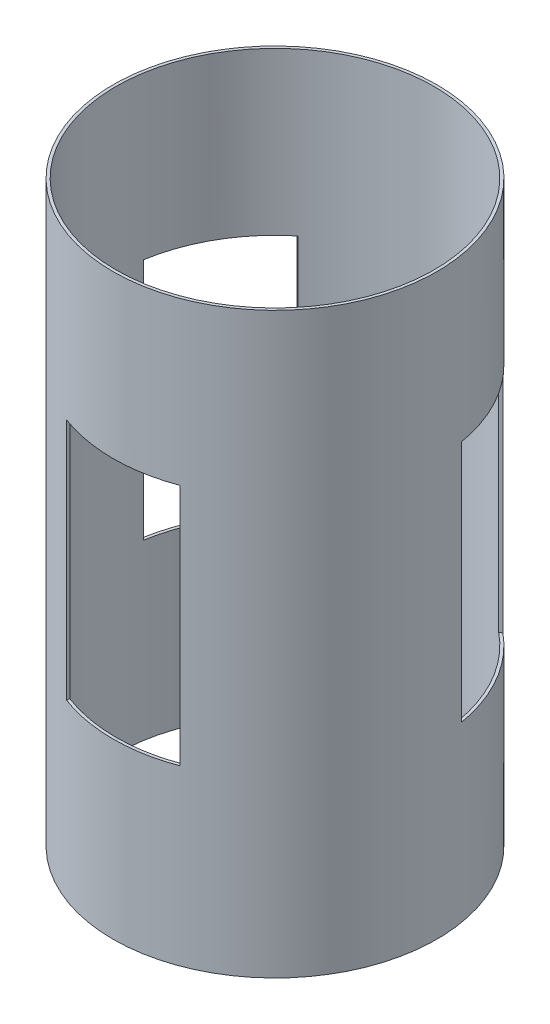
ISO-10303-21;
HEADER;
FILE_DESCRIPTION(('STEP AP214'),'2;1');
FILE_NAME('part.step','',(''),(''),'','','');
FILE_SCHEMA(('AUTOMOTIVE_DESIGN { 1 0 10303 214 1 1 1 1 }'));
ENDSEC;
DATA;
#1=APPLICATION_CONTEXT('core data for automotive mechanical design processes');
#2=APPLICATION_PROTOCOL_DEFINITION('international standard','automotive_design',2000,#1);
#3=PRODUCT_CONTEXT('',#1,'mechanical');
#4=PRODUCT('Part','Part','',(#3));
#5=PRODUCT_RELATED_PRODUCT_CATEGORY('part','',(#4));
#6=PRODUCT_DEFINITION_FORMATION('','',#4);
#7=PRODUCT_DEFINITION_CONTEXT('part definition',#1,'design');
#8=PRODUCT_DEFINITION('design','',#6,#7);
#9=PRODUCT_DEFINITION_SHAPE('','',#8);
#10=(LENGTH_UNIT() NAMED_UNIT(*) SI_UNIT(.MILLI.,.METRE.));
#11=(NAMED_UNIT(*) PLANE_ANGLE_UNIT() SI_UNIT($,.RADIAN.));
#12=(NAMED_UNIT(*) SI_UNIT($,.STERADIAN.) SOLID_ANGLE_UNIT());
#13=UNCERTAINTY_MEASURE_WITH_UNIT(LENGTH_MEASURE(1.E-05),#10,'distance_accuracy_value','');
#14=(GEOMETRIC_REPRESENTATION_CONTEXT(3) GLOBAL_UNCERTAINTY_ASSIGNED_CONTEXT((#13)) GLOBAL_UNIT_ASSIGNED_CONTEXT((#10,
#11,#12)) REPRESENTATION_CONTEXT('',''));
#15=CARTESIAN_POINT('',(0.,0.,0.));
#16=DIRECTION('',(0.,0.,1.));
#17=DIRECTION('',(1.,0.,0.));
#18=AXIS2_PLACEMENT_3D('',#15,#16,#17);
#19=CARTESIAN_POINT('',(0.,105.,0.));
#20=DIRECTION('',(0.,1.,0.));
#21=DIRECTION('',(0.,0.,1.));
#22=AXIS2_PLACEMENT_3D('',#19,#20,#21);
#23=PLANE('',#22);
#24=DIRECTION('',(0.866025403784442,0.,0.499999999999995));
#25=VECTOR('',#24,1.);
#26=CARTESIAN_POINT('',(12.2359582847371,105.,-21.1933014284583));
#27=LINE('',#26,#25);
#28=CARTESIAN_POINT('',(-44.56055546886,105.,-53.9847839331293));
#29=VERTEX_POINT('',#28);
#30=CARTESIAN_POINT('',(-43.4036485575343,105.,-53.3168434164482));
#31=VERTEX_POINT('',#30);
#32=EDGE_CURVE('E254',#29,#31,#27,.T.);
#33=ORIENTED_EDGE('',*,*,#32,.T.);
#34=CARTESIAN_POINT('',(0.,105.,0.));
#35=DIRECTION('',(0.,1.,0.));
#36=DIRECTION('',(0.,0.,1.));
#37=AXIS2_PLACEMENT_3D('',#34,#35,#36);
#38=CIRCLE('',#37,68.75);
#39=CARTESIAN_POINT('',(-67.8755651270083,105.,-10.9302405595327));
#40=VERTEX_POINT('',#39);
#41=EDGE_CURVE('E165',#31,#40,#38,.T.);
#42=ORIENTED_EDGE('',*,*,#41,.T.);
#43=DIRECTION('',(0.86602540378444,0.,0.499999999999999));
#44=VECTOR('',#43,1.);
#45=CARTESIAN_POINT('',(-12.2359582847368,105.,21.1933014284576));
#46=LINE('',#45,#44);
#47=CARTESIAN_POINT('',(-69.0324720383339,105.,-11.5981810762138));
#48=VERTEX_POINT('',#47);
#49=EDGE_CURVE('E213',#48,#40,#46,.T.);
#50=ORIENTED_EDGE('',*,*,#49,.F.);
#51=CARTESIAN_POINT('',(0.,105.,0.));
#52=DIRECTION('',(0.,1.,0.));
#53=DIRECTION('',(0.,0.,1.));
#54=AXIS2_PLACEMENT_3D('',#51,#52,#53);
#55=CIRCLE('',#54,70.);
#56=EDGE_CURVE('E66',#29,#48,#55,.T.);
#57=ORIENTED_EDGE('',*,*,#56,.F.);
#58=EDGE_LOOP('',(#33,#42,#50,#57));
#59=FACE_BOUND('',#58,.T.);
#60=ADVANCED_FACE('F50',(#59),#23,.F.);
#61=CARTESIAN_POINT('',(67.8755651270083,105.,-10.9302405595325));
#62=VERTEX_POINT('',#61);
#63=CARTESIAN_POINT('',(43.4036485575344,105.,-53.3168434164481));
#64=VERTEX_POINT('',#63);
#65=EDGE_CURVE('E204',#62,#64,#38,.T.);
#66=ORIENTED_EDGE('',*,*,#65,.T.);
#67=DIRECTION('',(-0.866025403784438,0.,0.500000000000001));
#68=VECTOR('',#67,1.);
#69=CARTESIAN_POINT('',(-12.235958284737,105.,-21.1933014284577));
#70=LINE('',#69,#68);
#71=CARTESIAN_POINT('',(44.56055546886,105.,-53.9847839331293));
#72=VERTEX_POINT('',#71);
#73=EDGE_CURVE('E74',#72,#64,#70,.T.);
#74=ORIENTED_EDGE('',*,*,#73,.F.);
#75=CARTESIAN_POINT('',(69.032472038334,105.,-11.5981810762138));
#76=VERTEX_POINT('',#75);
#77=EDGE_CURVE('E212',#76,#72,#55,.T.);
#78=ORIENTED_EDGE('',*,*,#77,.F.);
#79=DIRECTION('',(-0.866025403784427,0.,0.500000000000021));
#80=VECTOR('',#79,1.);
#81=CARTESIAN_POINT('',(12.2359582847382,105.,21.1933014284588));
#82=LINE('',#81,#80);
#83=EDGE_CURVE('E185',#76,#62,#82,.T.);
#84=ORIENTED_EDGE('',*,*,#83,.T.);
#85=EDGE_LOOP('',(#66,#74,#78,#84));
#86=FACE_BOUND('',#85,.T.);
#87=ADVANCED_FACE('F327',(#86),#23,.F.);
#88=CARTESIAN_POINT('',(-12.2359582847368,105.,21.1933014284576));
#89=DIRECTION('',(0.499999999999999,0.,-0.866025403784439));
#90=DIRECTION('',(-0.866025403784439,0.,-0.499999999999999));
#91=AXIS2_PLACEMENT_3D('',#88,#89,#90);
#92=PLANE('',#91);
#93=DIRECTION('',(0.86602540378444,0.,0.499999999999999));
#94=VECTOR('',#93,1.);
#95=CARTESIAN_POINT('',(-12.2359582847368,0.,21.1933014284576));
#96=LINE('',#95,#94);
#97=CARTESIAN_POINT('',(-69.0324720383339,0.,-11.5981810762139));
#98=VERTEX_POINT('',#97);
#99=CARTESIAN_POINT('',(-67.8755651270083,0.,-10.9302405595327));
#100=VERTEX_POINT('',#99);
#101=EDGE_CURVE('E209',#98,#100,#96,.T.);
#102=ORIENTED_EDGE('',*,*,#101,.F.);
#103=DIRECTION('',(0.,-1.,0.));
#104=VECTOR('',#103,1.);
#105=CARTESIAN_POINT('',(-69.0324720383339,105.,-11.5981810762138));
#106=LINE('',#105,#104);
#107=EDGE_CURVE('E12',#48,#98,#106,.T.);
#108=ORIENTED_EDGE('',*,*,#107,.F.);
#109=ORIENTED_EDGE('',*,*,#49,.T.);
#110=DIRECTION('',(0.,-1.,0.));
#111=VECTOR('',#110,1.);
#112=CARTESIAN_POINT('',(-67.8755651270083,105.,-10.9302405595327));
#113=LINE('',#112,#111);
#114=EDGE_CURVE('E221',#40,#100,#113,.T.);
#115=ORIENTED_EDGE('',*,*,#114,.T.);
#116=EDGE_LOOP('',(#102,#108,#109,#115));
#117=FACE_BOUND('',#116,.T.);
#118=ADVANCED_FACE('F52',(#117),#92,.T.);
#119=CARTESIAN_POINT('',(0.,105.,0.));
#120=DIRECTION('',(0.,-1.,0.));
#121=DIRECTION('',(0.,0.,-1.));
#122=AXIS2_PLACEMENT_3D('',#119,#120,#121);
#123=CYLINDRICAL_SURFACE('',#122,70.);
#124=CARTESIAN_POINT('',(0.,0.,0.));
#125=DIRECTION('',(0.,1.,0.));
#126=DIRECTION('',(0.,0.,1.));
#127=AXIS2_PLACEMENT_3D('',#124,#125,#126);
#128=CIRCLE('',#127,70.);
#129=CARTESIAN_POINT('',(-24.4719165694739,0.,65.582965009343));
#130=VERTEX_POINT('',#129);
#131=CARTESIAN_POINT('',(24.4719165694739,0.,65.582965009343));
#132=VERTEX_POINT('',#131);
#133=EDGE_CURVE('E140',#130,#132,#128,.T.);
#134=ORIENTED_EDGE('',*,*,#133,.F.);
#135=DIRECTION('',(0.,-1.,0.));
#136=VECTOR('',#135,1.);
#137=CARTESIAN_POINT('',(-24.4719165694739,105.,65.582965009343));
#138=LINE('',#137,#136);
#139=CARTESIAN_POINT('',(-24.4719165694739,105.,65.582965009343));
#140=VERTEX_POINT('',#139);
#141=EDGE_CURVE('E59',#140,#130,#138,.T.);
#142=ORIENTED_EDGE('',*,*,#141,.F.);
#143=CARTESIAN_POINT('',(24.4719165694739,105.,65.582965009343));
#144=VERTEX_POINT('',#143);
#145=EDGE_CURVE('E161',#140,#144,#55,.T.);
#146=ORIENTED_EDGE('',*,*,#145,.T.);
#147=DIRECTION('',(0.,-1.,0.));
#148=VECTOR('',#147,1.);
#149=CARTESIAN_POINT('',(24.4719165694739,105.,65.582965009343));
#150=LINE('',#149,#148);
#151=EDGE_CURVE('E157',#144,#132,#150,.T.);
#152=ORIENTED_EDGE('',*,*,#151,.T.);
#153=EDGE_LOOP('',(#134,#142,#146,#152));
#154=FACE_BOUND('',#153,.T.);
#155=CARTESIAN_POINT('',(69.032472038334,0.,-11.5981810762138));
#156=VERTEX_POINT('',#155);
#157=CARTESIAN_POINT('',(44.56055546886,0.,-53.9847839331293));
#158=VERTEX_POINT('',#157);
#159=EDGE_CURVE('E154',#156,#158,#128,.T.);
#160=ORIENTED_EDGE('',*,*,#159,.F.);
#161=DIRECTION('',(0.,-1.,0.));
#162=VECTOR('',#161,1.);
#163=CARTESIAN_POINT('',(69.032472038334,105.,-11.5981810762138));
#164=LINE('',#163,#162);
#165=EDGE_CURVE('E166',#76,#156,#164,.T.);
#166=ORIENTED_EDGE('',*,*,#165,.F.);
#167=ORIENTED_EDGE('',*,*,#77,.T.);
#168=DIRECTION('',(0.,-1.,0.));
#169=VECTOR('',#168,1.);
#170=CARTESIAN_POINT('',(44.5605554688601,105.,-53.9847839331293));
#171=LINE('',#170,#169);
#172=EDGE_CURVE('E174',#72,#158,#171,.T.);
#173=ORIENTED_EDGE('',*,*,#172,.T.);
#174=EDGE_LOOP('',(#160,#166,#167,#173));
#175=FACE_BOUND('',#174,.T.);
#176=ORIENTED_EDGE('',*,*,#107,.T.);
#177=CARTESIAN_POINT('',(-44.56055546886,0.,-53.9847839331294));
#178=VERTEX_POINT('',#177);
#179=EDGE_CURVE('E151',#178,#98,#128,.T.);
#180=ORIENTED_EDGE('',*,*,#179,.F.);
#181=DIRECTION('',(0.,-1.,0.));
#182=VECTOR('',#181,1.);
#183=CARTESIAN_POINT('',(-44.56055546886,105.,-53.9847839331294));
#184=LINE('',#183,#182);
#185=EDGE_CURVE('E182',#29,#178,#184,.T.);
#186=ORIENTED_EDGE('',*,*,#185,.F.);
#187=ORIENTED_EDGE('',*,*,#56,.T.);
#188=EDGE_LOOP('',(#176,#180,#186,#187));
#189=FACE_BOUND('',#188,.T.);
#190=CARTESIAN_POINT('',(0.,175.,0.));
#191=DIRECTION('',(0.,1.,0.));
#192=DIRECTION('',(0.,0.,1.));
#193=AXIS2_PLACEMENT_3D('',#190,#191,#192);
#194=CIRCLE('',#193,70.);
#195=CARTESIAN_POINT('',(0.,175.,70.));
#196=VERTEX_POINT('',#195);
#197=EDGE_CURVE('E205',#196,#196,#194,.T.);
#198=ORIENTED_EDGE('',*,*,#197,.F.);
#199=EDGE_LOOP('',(#198));
#200=FACE_BOUND('',#199,.T.);
#201=CARTESIAN_POINT('',(0.,-75.,0.));
#202=DIRECTION('',(0.,1.,0.));
#203=DIRECTION('',(0.,0.,1.));
#204=AXIS2_PLACEMENT_3D('',#201,#202,#203);
#205=CIRCLE('',#204,70.);
#206=CARTESIAN_POINT('',(0.,-75.,70.));
#207=VERTEX_POINT('',#206);
#208=EDGE_CURVE('E262',#207,#207,#205,.T.);
#209=ORIENTED_EDGE('',*,*,#208,.T.);
#210=EDGE_LOOP('',(#209));
#211=FACE_BOUND('',#210,.T.);
#212=ADVANCED_FACE('F158',(#154,#175,#189,#200,#211),#123,.T.);
#213=CARTESIAN_POINT('',(-24.4719165694741,105.,0.));
#214=DIRECTION('',(-1.,0.,0.));
#215=DIRECTION('',(0.,0.,1.));
#216=AXIS2_PLACEMENT_3D('',#213,#214,#215);
#217=PLANE('',#216);
#218=DIRECTION('',(0.,0.,-1.));
#219=VECTOR('',#218,1.);
#220=CARTESIAN_POINT('',(-24.4719165694741,0.,0.));
#221=LINE('',#220,#219);
#222=CARTESIAN_POINT('',(-24.4719165694739,0.,64.2470839759806));
#223=VERTEX_POINT('',#222);
#224=EDGE_CURVE('E147',#130,#223,#221,.T.);
#225=ORIENTED_EDGE('',*,*,#224,.T.);
#226=DIRECTION('',(0.,-1.,0.));
#227=VECTOR('',#226,1.);
#228=CARTESIAN_POINT('',(-24.4719165694739,105.,64.2470839759806));
#229=LINE('',#228,#227);
#230=CARTESIAN_POINT('',(-24.4719165694739,105.,64.2470839759806));
#231=VERTEX_POINT('',#230);
#232=EDGE_CURVE('E229',#231,#223,#229,.T.);
#233=ORIENTED_EDGE('',*,*,#232,.F.);
#234=DIRECTION('',(0.,0.,-1.));
#235=VECTOR('',#234,1.);
#236=CARTESIAN_POINT('',(-24.4719165694741,105.,0.));
#237=LINE('',#236,#235);
#238=EDGE_CURVE('E217',#140,#231,#237,.T.);
#239=ORIENTED_EDGE('',*,*,#238,.F.);
#240=ORIENTED_EDGE('',*,*,#141,.T.);
#241=EDGE_LOOP('',(#225,#233,#239,#240));
#242=FACE_BOUND('',#241,.T.);
#243=ADVANCED_FACE('F235',(#242),#217,.F.);
#244=CARTESIAN_POINT('',(0.,105.,0.));
#245=DIRECTION('',(0.,-1.,0.));
#246=DIRECTION('',(0.,0.,-1.));
#247=AXIS2_PLACEMENT_3D('',#244,#245,#246);
#248=CYLINDRICAL_SURFACE('',#247,68.75);
#249=ORIENTED_EDGE('',*,*,#232,.T.);
#250=CARTESIAN_POINT('',(0.,0.,0.));
#251=DIRECTION('',(0.,1.,0.));
#252=DIRECTION('',(0.,0.,1.));
#253=AXIS2_PLACEMENT_3D('',#250,#251,#252);
#254=CIRCLE('',#253,68.75);
#255=CARTESIAN_POINT('',(24.4719165694739,0.,64.2470839759806));
#256=VERTEX_POINT('',#255);
#257=EDGE_CURVE('E267',#223,#256,#254,.T.);
#258=ORIENTED_EDGE('',*,*,#257,.T.);
#259=DIRECTION('',(0.,-1.,0.));
#260=VECTOR('',#259,1.);
#261=CARTESIAN_POINT('',(24.4719165694739,105.,64.2470839759806));
#262=LINE('',#261,#260);
#263=CARTESIAN_POINT('',(24.4719165694739,105.,64.2470839759806));
#264=VERTEX_POINT('',#263);
#265=EDGE_CURVE('E171',#264,#256,#262,.T.);
#266=ORIENTED_EDGE('',*,*,#265,.F.);
#267=EDGE_CURVE('E201',#231,#264,#38,.T.);
#268=ORIENTED_EDGE('',*,*,#267,.F.);
#269=EDGE_LOOP('',(#249,#258,#266,#268));
#270=FACE_BOUND('',#269,.T.);
#271=DIRECTION('',(0.,-1.,0.));
#272=VECTOR('',#271,1.);
#273=CARTESIAN_POINT('',(67.8755651270083,105.,-10.9302405595325));
#274=LINE('',#273,#272);
#275=CARTESIAN_POINT('',(67.8755651270083,0.,-10.9302405595325));
#276=VERTEX_POINT('',#275);
#277=EDGE_CURVE('E190',#62,#276,#274,.T.);
#278=ORIENTED_EDGE('',*,*,#277,.T.);
#279=CARTESIAN_POINT('',(43.4036485575344,0.,-53.3168434164481));
#280=VERTEX_POINT('',#279);
#281=EDGE_CURVE('E152',#276,#280,#254,.T.);
#282=ORIENTED_EDGE('',*,*,#281,.T.);
#283=DIRECTION('',(0.,-1.,0.));
#284=VECTOR('',#283,1.);
#285=CARTESIAN_POINT('',(43.4036485575344,105.,-53.3168434164481));
#286=LINE('',#285,#284);
#287=EDGE_CURVE('E250',#64,#280,#286,.T.);
#288=ORIENTED_EDGE('',*,*,#287,.F.);
#289=ORIENTED_EDGE('',*,*,#65,.F.);
#290=EDGE_LOOP('',(#278,#282,#288,#289));
#291=FACE_BOUND('',#290,.T.);
#292=CARTESIAN_POINT('',(-43.4036485575343,0.,-53.3168434164482));
#293=VERTEX_POINT('',#292);
#294=EDGE_CURVE('E270',#293,#100,#254,.T.);
#295=ORIENTED_EDGE('',*,*,#294,.T.);
#296=ORIENTED_EDGE('',*,*,#114,.F.);
#297=ORIENTED_EDGE('',*,*,#41,.F.);
#298=DIRECTION('',(0.,-1.,0.));
#299=VECTOR('',#298,1.);
#300=CARTESIAN_POINT('',(-43.4036485575343,105.,-53.3168434164482));
#301=LINE('',#300,#299);
#302=EDGE_CURVE('E246',#31,#293,#301,.T.);
#303=ORIENTED_EDGE('',*,*,#302,.T.);
#304=EDGE_LOOP('',(#295,#296,#297,#303));
#305=FACE_BOUND('',#304,.T.);
#306=CARTESIAN_POINT('',(0.,175.,0.));
#307=DIRECTION('',(0.,1.,0.));
#308=DIRECTION('',(0.,0.,1.));
#309=AXIS2_PLACEMENT_3D('',#306,#307,#308);
#310=CIRCLE('',#309,68.75);
#311=CARTESIAN_POINT('',(0.,175.,68.75));
#312=VERTEX_POINT('',#311);
#313=EDGE_CURVE('E197',#312,#312,#310,.T.);
#314=ORIENTED_EDGE('',*,*,#313,.T.);
#315=EDGE_LOOP('',(#314));
#316=FACE_BOUND('',#315,.T.);
#317=CARTESIAN_POINT('',(0.,-75.,0.));
#318=DIRECTION('',(0.,1.,0.));
#319=DIRECTION('',(0.,0.,1.));
#320=AXIS2_PLACEMENT_3D('',#317,#318,#319);
#321=CIRCLE('',#320,68.75);
#322=CARTESIAN_POINT('',(0.,-75.,68.75));
#323=VERTEX_POINT('',#322);
#324=EDGE_CURVE('E274',#323,#323,#321,.T.);
#325=ORIENTED_EDGE('',*,*,#324,.F.);
#326=EDGE_LOOP('',(#325));
#327=FACE_BOUND('',#326,.T.);
#328=ADVANCED_FACE('F294',(#270,#291,#305,#316,#327),#248,.F.);
#329=CARTESIAN_POINT('',(0.,175.,0.));
#330=DIRECTION('',(0.,1.,0.));
#331=DIRECTION('',(0.,0.,1.));
#332=AXIS2_PLACEMENT_3D('',#329,#330,#331);
#333=PLANE('',#332);
#334=ORIENTED_EDGE('',*,*,#197,.T.);
#335=EDGE_LOOP('',(#334));
#336=FACE_BOUND('',#335,.T.);
#337=ORIENTED_EDGE('',*,*,#313,.F.);
#338=EDGE_LOOP('',(#337));
#339=FACE_BOUND('',#338,.T.);
#340=ADVANCED_FACE('F335',(#336,#339),#333,.T.);
#341=ORIENTED_EDGE('',*,*,#267,.T.);
#342=DIRECTION('',(0.,0.,-1.));
#343=VECTOR('',#342,1.);
#344=CARTESIAN_POINT('',(24.4719165694741,105.,0.));
#345=LINE('',#344,#343);
#346=EDGE_CURVE('E179',#144,#264,#345,.T.);
#347=ORIENTED_EDGE('',*,*,#346,.F.);
#348=ORIENTED_EDGE('',*,*,#145,.F.);
#349=ORIENTED_EDGE('',*,*,#238,.T.);
#350=EDGE_LOOP('',(#341,#347,#348,#349));
#351=FACE_BOUND('',#350,.T.);
#352=ADVANCED_FACE('F238',(#351),#23,.F.);
#353=CARTESIAN_POINT('',(24.4719165694741,105.,0.));
#354=DIRECTION('',(-1.,0.,0.));
#355=DIRECTION('',(0.,0.,1.));
#356=AXIS2_PLACEMENT_3D('',#353,#354,#355);
#357=PLANE('',#356);
#358=DIRECTION('',(0.,0.,-1.));
#359=VECTOR('',#358,1.);
#360=CARTESIAN_POINT('',(24.4719165694741,0.,0.));
#361=LINE('',#360,#359);
#362=EDGE_CURVE('E144',#132,#256,#361,.T.);
#363=ORIENTED_EDGE('',*,*,#362,.F.);
#364=ORIENTED_EDGE('',*,*,#151,.F.);
#365=ORIENTED_EDGE('',*,*,#346,.T.);
#366=ORIENTED_EDGE('',*,*,#265,.T.);
#367=EDGE_LOOP('',(#363,#364,#365,#366));
#368=FACE_BOUND('',#367,.T.);
#369=ADVANCED_FACE('F169',(#368),#357,.T.);
#370=CARTESIAN_POINT('',(12.2359582847382,105.,21.1933014284588));
#371=DIRECTION('',(0.500000000000021,0.,0.866025403784427));
#372=DIRECTION('',(0.866025403784427,0.,-0.500000000000021));
#373=AXIS2_PLACEMENT_3D('',#370,#371,#372);
#374=PLANE('',#373);
#375=DIRECTION('',(-0.866025403784427,0.,0.500000000000021));
#376=VECTOR('',#375,1.);
#377=CARTESIAN_POINT('',(12.2359582847382,0.,21.1933014284588));
#378=LINE('',#377,#376);
#379=EDGE_CURVE('E173',#156,#276,#378,.T.);
#380=ORIENTED_EDGE('',*,*,#379,.T.);
#381=ORIENTED_EDGE('',*,*,#277,.F.);
#382=ORIENTED_EDGE('',*,*,#83,.F.);
#383=ORIENTED_EDGE('',*,*,#165,.T.);
#384=EDGE_LOOP('',(#380,#381,#382,#383));
#385=FACE_BOUND('',#384,.T.);
#386=ADVANCED_FACE('F324',(#385),#374,.F.);
#387=CARTESIAN_POINT('',(-12.235958284737,105.,-21.1933014284577));
#388=DIRECTION('',(0.500000000000001,0.,0.866025403784438));
#389=DIRECTION('',(0.866025403784438,0.,-0.500000000000001));
#390=AXIS2_PLACEMENT_3D('',#387,#388,#389);
#391=PLANE('',#390);
#392=DIRECTION('',(-0.866025403784438,0.,0.500000000000001));
#393=VECTOR('',#392,1.);
#394=CARTESIAN_POINT('',(-12.235958284737,0.,-21.1933014284577));
#395=LINE('',#394,#393);
#396=EDGE_CURVE('E259',#158,#280,#395,.T.);
#397=ORIENTED_EDGE('',*,*,#396,.F.);
#398=ORIENTED_EDGE('',*,*,#172,.F.);
#399=ORIENTED_EDGE('',*,*,#73,.T.);
#400=ORIENTED_EDGE('',*,*,#287,.T.);
#401=EDGE_LOOP('',(#397,#398,#399,#400));
#402=FACE_BOUND('',#401,.T.);
#403=ADVANCED_FACE('F305',(#402),#391,.T.);
#404=CARTESIAN_POINT('',(12.2359582847371,105.,-21.1933014284583));
#405=DIRECTION('',(0.499999999999995,0.,-0.866025403784442));
#406=DIRECTION('',(-0.866025403784442,0.,-0.499999999999995));
#407=AXIS2_PLACEMENT_3D('',#404,#405,#406);
#408=PLANE('',#407);
#409=DIRECTION('',(0.866025403784442,0.,0.499999999999995));
#410=VECTOR('',#409,1.);
#411=CARTESIAN_POINT('',(12.2359582847371,0.,-21.1933014284583));
#412=LINE('',#411,#410);
#413=EDGE_CURVE('E255',#178,#293,#412,.T.);
#414=ORIENTED_EDGE('',*,*,#413,.T.);
#415=ORIENTED_EDGE('',*,*,#302,.F.);
#416=ORIENTED_EDGE('',*,*,#32,.F.);
#417=ORIENTED_EDGE('',*,*,#185,.T.);
#418=EDGE_LOOP('',(#414,#415,#416,#417));
#419=FACE_BOUND('',#418,.T.);
#420=ADVANCED_FACE('F315',(#419),#408,.F.);
#421=CARTESIAN_POINT('',(0.,0.,0.));
#422=DIRECTION('',(0.,1.,0.));
#423=DIRECTION('',(0.,0.,1.));
#424=AXIS2_PLACEMENT_3D('',#421,#422,#423);
#425=PLANE('',#424);
#426=ORIENTED_EDGE('',*,*,#224,.F.);
#427=ORIENTED_EDGE('',*,*,#133,.T.);
#428=ORIENTED_EDGE('',*,*,#362,.T.);
#429=ORIENTED_EDGE('',*,*,#257,.F.);
#430=EDGE_LOOP('',(#426,#427,#428,#429));
#431=FACE_BOUND('',#430,.T.);
#432=ADVANCED_FACE('F142',(#431),#425,.T.);
#433=ORIENTED_EDGE('',*,*,#379,.F.);
#434=ORIENTED_EDGE('',*,*,#159,.T.);
#435=ORIENTED_EDGE('',*,*,#396,.T.);
#436=ORIENTED_EDGE('',*,*,#281,.F.);
#437=EDGE_LOOP('',(#433,#434,#435,#436));
#438=FACE_BOUND('',#437,.T.);
#439=ADVANCED_FACE('F322',(#438),#425,.T.);
#440=CARTESIAN_POINT('',(0.,-75.,0.));
#441=DIRECTION('',(0.,1.,0.));
#442=DIRECTION('',(0.,0.,1.));
#443=AXIS2_PLACEMENT_3D('',#440,#441,#442);
#444=PLANE('',#443);
#445=ORIENTED_EDGE('',*,*,#324,.T.);
#446=EDGE_LOOP('',(#445));
#447=FACE_BOUND('',#446,.T.);
#448=ORIENTED_EDGE('',*,*,#208,.F.);
#449=EDGE_LOOP('',(#448));
#450=FACE_BOUND('',#449,.T.);
#451=ADVANCED_FACE('F353',(#447,#450),#444,.F.);
#452=ORIENTED_EDGE('',*,*,#179,.T.);
#453=ORIENTED_EDGE('',*,*,#101,.T.);
#454=ORIENTED_EDGE('',*,*,#294,.F.);
#455=ORIENTED_EDGE('',*,*,#413,.F.);
#456=EDGE_LOOP('',(#452,#453,#454,#455));
#457=FACE_BOUND('',#456,.T.);
#458=ADVANCED_FACE('F285',(#457),#425,.T.);
#459=CLOSED_SHELL('',(#60,#87,#118,#212,#243,#328,#340,#352,#369,#386,#403,#420,#432,#439,#451,#458));
#460=MANIFOLD_SOLID_BREP('B2',#459);
#461=ADVANCED_BREP_SHAPE_REPRESENTATION('',(#18,#460),#14);
#462=SHAPE_DEFINITION_REPRESENTATION(#9,#461);
ENDSEC;
END-ISO-10303-21;
